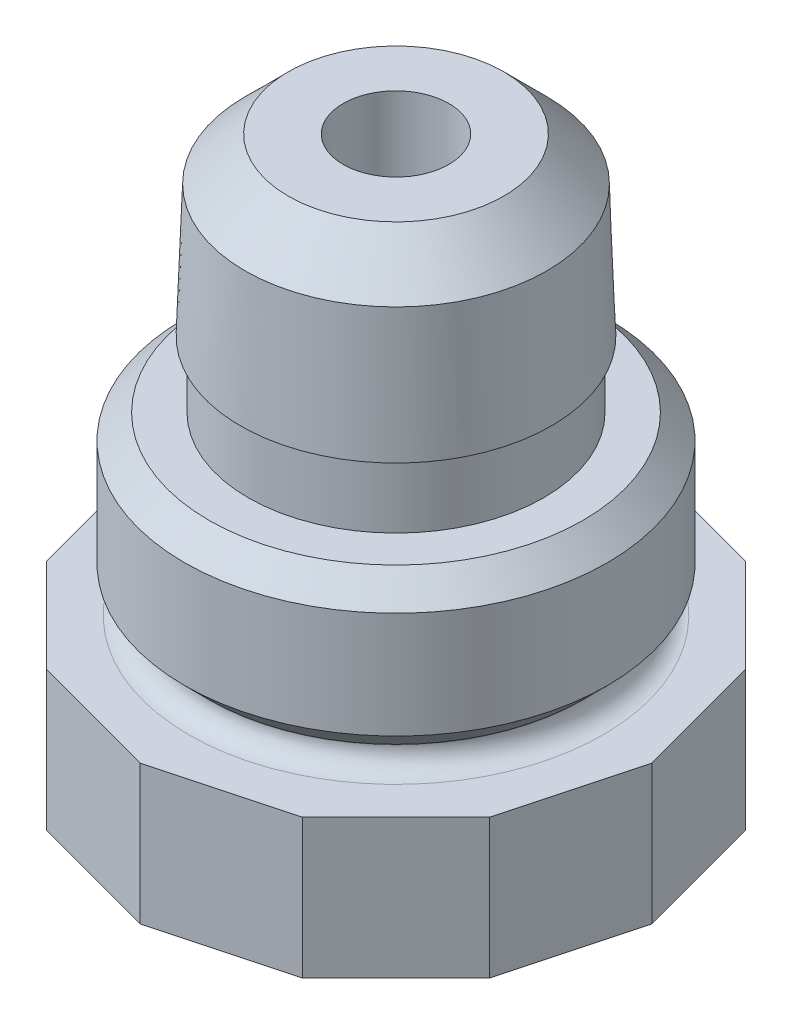
ISO-10303-21;
HEADER;
FILE_DESCRIPTION(('STEP AP214'),'2;1');
FILE_NAME('part.step','',(''),(''),'','','');
FILE_SCHEMA(('AUTOMOTIVE_DESIGN { 1 0 10303 214 1 1 1 1 }'));
ENDSEC;
DATA;
#1=APPLICATION_CONTEXT('core data for automotive mechanical design processes');
#2=APPLICATION_PROTOCOL_DEFINITION('international standard','automotive_design',2000,#1);
#3=PRODUCT_CONTEXT('',#1,'mechanical');
#4=PRODUCT('Part','Part','',(#3));
#5=PRODUCT_RELATED_PRODUCT_CATEGORY('part','',(#4));
#6=PRODUCT_DEFINITION_FORMATION('','',#4);
#7=PRODUCT_DEFINITION_CONTEXT('part definition',#1,'design');
#8=PRODUCT_DEFINITION('design','',#6,#7);
#9=PRODUCT_DEFINITION_SHAPE('','',#8);
#10=(LENGTH_UNIT() NAMED_UNIT(*) SI_UNIT(.MILLI.,.METRE.));
#11=(NAMED_UNIT(*) PLANE_ANGLE_UNIT() SI_UNIT($,.RADIAN.));
#12=(NAMED_UNIT(*) SI_UNIT($,.STERADIAN.) SOLID_ANGLE_UNIT());
#13=UNCERTAINTY_MEASURE_WITH_UNIT(LENGTH_MEASURE(1.E-05),#10,'distance_accuracy_value','');
#14=(GEOMETRIC_REPRESENTATION_CONTEXT(3) GLOBAL_UNCERTAINTY_ASSIGNED_CONTEXT((#13)) GLOBAL_UNIT_ASSIGNED_CONTEXT((#10,
#11,#12)) REPRESENTATION_CONTEXT('',''));
#15=CARTESIAN_POINT('',(0.,0.,0.));
#16=DIRECTION('',(0.,0.,1.));
#17=DIRECTION('',(1.,0.,0.));
#18=AXIS2_PLACEMENT_3D('',#15,#16,#17);
#19=CARTESIAN_POINT('',(-13.2264323420944,-7.54,-22.9088528193797));
#20=DIRECTION('',(0.,1.,0.));
#21=DIRECTION('',(0.,0.,1.));
#22=AXIS2_PLACEMENT_3D('',#19,#20,#21);
#23=PLANE('',#22);
#24=DIRECTION('',(-0.965925826289068,0.,-0.258819045102521));
#25=VECTOR('',#24,1.);
#26=CARTESIAN_POINT('',(9.68242047728531,-7.54,-16.7704442069035));
#27=LINE('',#26,#25);
#28=CARTESIAN_POINT('',(9.68242047728531,-7.54,-16.7704442069035));
#29=VERTEX_POINT('',#28);
#30=CARTESIAN_POINT('',(0.,-7.54,-19.3648409545706));
#31=VERTEX_POINT('',#30);
#32=EDGE_CURVE('E175',#29,#31,#27,.T.);
#33=ORIENTED_EDGE('',*,*,#32,.F.);
#34=DIRECTION('',(-0.707106781186548,0.,-0.707106781186548));
#35=VECTOR('',#34,1.);
#36=CARTESIAN_POINT('',(16.7704442069035,-7.54,-9.68242047728531));
#37=LINE('',#36,#35);
#38=CARTESIAN_POINT('',(16.7704442069035,-7.54,-9.68242047728531));
#39=VERTEX_POINT('',#38);
#40=EDGE_CURVE('E131',#39,#29,#37,.T.);
#41=ORIENTED_EDGE('',*,*,#40,.F.);
#42=DIRECTION('',(-0.25881904510252,0.,-0.965925826289068));
#43=VECTOR('',#42,1.);
#44=CARTESIAN_POINT('',(19.3648409545706,-7.54,0.));
#45=LINE('',#44,#43);
#46=CARTESIAN_POINT('',(19.3648409545706,-7.54,0.));
#47=VERTEX_POINT('',#46);
#48=EDGE_CURVE('E116',#47,#39,#45,.T.);
#49=ORIENTED_EDGE('',*,*,#48,.F.);
#50=DIRECTION('',(0.258819045102522,0.,-0.965925826289068));
#51=VECTOR('',#50,1.);
#52=CARTESIAN_POINT('',(16.7704442069034,-7.54,9.68242047728536));
#53=LINE('',#52,#51);
#54=CARTESIAN_POINT('',(16.7704442069034,-7.54,9.68242047728536));
#55=VERTEX_POINT('',#54);
#56=EDGE_CURVE('E129',#55,#47,#53,.T.);
#57=ORIENTED_EDGE('',*,*,#56,.F.);
#58=DIRECTION('',(0.707106781186547,0.,-0.707106781186547));
#59=VECTOR('',#58,1.);
#60=CARTESIAN_POINT('',(9.68242047728534,-7.54,16.7704442069034));
#61=LINE('',#60,#59);
#62=CARTESIAN_POINT('',(9.68242047728534,-7.54,16.7704442069034));
#63=VERTEX_POINT('',#62);
#64=EDGE_CURVE('E134',#63,#55,#61,.T.);
#65=ORIENTED_EDGE('',*,*,#64,.F.);
#66=DIRECTION('',(0.965925826289068,0.,-0.258819045102521));
#67=VECTOR('',#66,1.);
#68=CARTESIAN_POINT('',(0.,-7.54,19.3648409545706));
#69=LINE('',#68,#67);
#70=CARTESIAN_POINT('',(0.,-7.54,19.3648409545706));
#71=VERTEX_POINT('',#70);
#72=EDGE_CURVE('E136',#71,#63,#69,.T.);
#73=ORIENTED_EDGE('',*,*,#72,.F.);
#74=DIRECTION('',(0.965925826289068,0.,0.258819045102521));
#75=VECTOR('',#74,1.);
#76=CARTESIAN_POINT('',(-9.68242047728527,-7.54,16.7704442069035));
#77=LINE('',#76,#75);
#78=CARTESIAN_POINT('',(-9.68242047728527,-7.54,16.7704442069035));
#79=VERTEX_POINT('',#78);
#80=EDGE_CURVE('E275',#79,#71,#77,.T.);
#81=ORIENTED_EDGE('',*,*,#80,.F.);
#82=DIRECTION('',(0.707106781186548,0.,0.707106781186548));
#83=VECTOR('',#82,1.);
#84=CARTESIAN_POINT('',(-16.7704442069034,-7.54,9.68242047728531));
#85=LINE('',#84,#83);
#86=CARTESIAN_POINT('',(-16.7704442069034,-7.54,9.68242047728531));
#87=VERTEX_POINT('',#86);
#88=EDGE_CURVE('E276',#87,#79,#85,.T.);
#89=ORIENTED_EDGE('',*,*,#88,.F.);
#90=DIRECTION('',(0.258819045102521,0.,0.965925826289068));
#91=VECTOR('',#90,1.);
#92=CARTESIAN_POINT('',(-19.3648409545706,-7.54,0.));
#93=LINE('',#92,#91);
#94=CARTESIAN_POINT('',(-19.3648409545706,-7.54,0.));
#95=VERTEX_POINT('',#94);
#96=EDGE_CURVE('E281',#95,#87,#93,.T.);
#97=ORIENTED_EDGE('',*,*,#96,.F.);
#98=DIRECTION('',(-0.258819045102521,0.,0.965925826289068));
#99=VECTOR('',#98,1.);
#100=CARTESIAN_POINT('',(-16.7704442069034,-7.54,-9.68242047728533));
#101=LINE('',#100,#99);
#102=CARTESIAN_POINT('',(-16.7704442069034,-7.54,-9.68242047728533));
#103=VERTEX_POINT('',#102);
#104=EDGE_CURVE('E284',#103,#95,#101,.T.);
#105=ORIENTED_EDGE('',*,*,#104,.F.);
#106=DIRECTION('',(-0.707106781186548,0.,0.707106781186547));
#107=VECTOR('',#106,1.);
#108=CARTESIAN_POINT('',(-9.68242047728532,-7.54,-16.7704442069034));
#109=LINE('',#108,#107);
#110=CARTESIAN_POINT('',(-9.68242047728532,-7.54,-16.7704442069034));
#111=VERTEX_POINT('',#110);
#112=EDGE_CURVE('E287',#111,#103,#109,.T.);
#113=ORIENTED_EDGE('',*,*,#112,.F.);
#114=DIRECTION('',(-0.965925826289068,0.,0.25881904510252));
#115=VECTOR('',#114,1.);
#116=CARTESIAN_POINT('',(0.,-7.54,-19.3648409545706));
#117=LINE('',#116,#115);
#118=EDGE_CURVE('E290',#31,#111,#117,.T.);
#119=ORIENTED_EDGE('',*,*,#118,.F.);
#120=EDGE_LOOP('',(#33,#41,#49,#57,#65,#73,#81,#89,#97,#105,#113,#119));
#121=FACE_BOUND('',#120,.T.);
#122=CARTESIAN_POINT('',(0.,-7.54,0.));
#123=DIRECTION('',(0.,-1.,0.));
#124=DIRECTION('',(0.,0.,-1.));
#125=AXIS2_PLACEMENT_3D('',#122,#123,#124);
#126=CIRCLE('',#125,15.1);
#127=CARTESIAN_POINT('',(0.,-7.54,-15.1));
#128=VERTEX_POINT('',#127);
#129=EDGE_CURVE('E322',#128,#128,#126,.T.);
#130=ORIENTED_EDGE('',*,*,#129,.F.);
#131=EDGE_LOOP('',(#130));
#132=FACE_BOUND('',#131,.T.);
#133=ADVANCED_FACE('F17',(#121,#132),#23,.F.);
#134=CARTESIAN_POINT('',(-13.2264323420944,3.,-22.9088528193797));
#135=DIRECTION('',(0.,1.,0.));
#136=DIRECTION('',(0.,0.,1.));
#137=AXIS2_PLACEMENT_3D('',#134,#135,#136);
#138=PLANE('',#137);
#139=CARTESIAN_POINT('',(0.,3.,0.));
#140=DIRECTION('',(0.,1.,0.));
#141=DIRECTION('',(0.,0.,1.));
#142=AXIS2_PLACEMENT_3D('',#139,#140,#141);
#143=CIRCLE('',#142,15.67);
#144=CARTESIAN_POINT('',(0.,3.,15.67));
#145=VERTEX_POINT('',#144);
#146=EDGE_CURVE('E26',#145,#145,#143,.F.);
#147=ORIENTED_EDGE('',*,*,#146,.T.);
#148=EDGE_LOOP('',(#147));
#149=FACE_BOUND('',#148,.T.);
#150=DIRECTION('',(-0.965925826289068,0.,-0.258819045102521));
#151=VECTOR('',#150,1.);
#152=CARTESIAN_POINT('',(9.68242047728531,3.,-16.7704442069035));
#153=LINE('',#152,#151);
#154=CARTESIAN_POINT('',(9.68242047728531,3.,-16.7704442069035));
#155=VERTEX_POINT('',#154);
#156=CARTESIAN_POINT('',(0.,3.,-19.3648409545706));
#157=VERTEX_POINT('',#156);
#158=EDGE_CURVE('E141',#155,#157,#153,.T.);
#159=ORIENTED_EDGE('',*,*,#158,.T.);
#160=DIRECTION('',(-0.965925826289068,0.,0.25881904510252));
#161=VECTOR('',#160,1.);
#162=CARTESIAN_POINT('',(0.,3.,-19.3648409545706));
#163=LINE('',#162,#161);
#164=CARTESIAN_POINT('',(-9.68242047728532,3.,-16.7704442069034));
#165=VERTEX_POINT('',#164);
#166=EDGE_CURVE('E144',#157,#165,#163,.T.);
#167=ORIENTED_EDGE('',*,*,#166,.T.);
#168=DIRECTION('',(-0.707106781186548,0.,0.707106781186547));
#169=VECTOR('',#168,1.);
#170=CARTESIAN_POINT('',(-9.68242047728532,3.,-16.7704442069034));
#171=LINE('',#170,#169);
#172=CARTESIAN_POINT('',(-16.7704442069034,3.,-9.68242047728533));
#173=VERTEX_POINT('',#172);
#174=EDGE_CURVE('E148',#165,#173,#171,.T.);
#175=ORIENTED_EDGE('',*,*,#174,.T.);
#176=DIRECTION('',(-0.258819045102521,0.,0.965925826289068));
#177=VECTOR('',#176,1.);
#178=CARTESIAN_POINT('',(-16.7704442069034,3.,-9.68242047728533));
#179=LINE('',#178,#177);
#180=CARTESIAN_POINT('',(-19.3648409545706,3.,0.));
#181=VERTEX_POINT('',#180);
#182=EDGE_CURVE('E151',#173,#181,#179,.T.);
#183=ORIENTED_EDGE('',*,*,#182,.T.);
#184=DIRECTION('',(0.258819045102521,0.,0.965925826289068));
#185=VECTOR('',#184,1.);
#186=CARTESIAN_POINT('',(-19.3648409545706,3.,0.));
#187=LINE('',#186,#185);
#188=CARTESIAN_POINT('',(-16.7704442069034,3.,9.68242047728531));
#189=VERTEX_POINT('',#188);
#190=EDGE_CURVE('E154',#181,#189,#187,.T.);
#191=ORIENTED_EDGE('',*,*,#190,.T.);
#192=DIRECTION('',(0.707106781186548,0.,0.707106781186548));
#193=VECTOR('',#192,1.);
#194=CARTESIAN_POINT('',(-16.7704442069034,3.,9.68242047728531));
#195=LINE('',#194,#193);
#196=CARTESIAN_POINT('',(-9.68242047728527,3.,16.7704442069035));
#197=VERTEX_POINT('',#196);
#198=EDGE_CURVE('E157',#189,#197,#195,.T.);
#199=ORIENTED_EDGE('',*,*,#198,.T.);
#200=DIRECTION('',(0.965925826289068,0.,0.258819045102521));
#201=VECTOR('',#200,1.);
#202=CARTESIAN_POINT('',(-9.68242047728527,3.,16.7704442069035));
#203=LINE('',#202,#201);
#204=CARTESIAN_POINT('',(0.,3.,19.3648409545706));
#205=VERTEX_POINT('',#204);
#206=EDGE_CURVE('E160',#197,#205,#203,.T.);
#207=ORIENTED_EDGE('',*,*,#206,.T.);
#208=DIRECTION('',(0.965925826289068,0.,-0.258819045102521));
#209=VECTOR('',#208,1.);
#210=CARTESIAN_POINT('',(0.,3.,19.3648409545706));
#211=LINE('',#210,#209);
#212=CARTESIAN_POINT('',(9.68242047728534,3.,16.7704442069034));
#213=VERTEX_POINT('',#212);
#214=EDGE_CURVE('E163',#205,#213,#211,.T.);
#215=ORIENTED_EDGE('',*,*,#214,.T.);
#216=DIRECTION('',(0.707106781186547,0.,-0.707106781186547));
#217=VECTOR('',#216,1.);
#218=CARTESIAN_POINT('',(9.68242047728534,3.,16.7704442069034));
#219=LINE('',#218,#217);
#220=CARTESIAN_POINT('',(16.7704442069034,3.,9.68242047728536));
#221=VERTEX_POINT('',#220);
#222=EDGE_CURVE('E166',#213,#221,#219,.T.);
#223=ORIENTED_EDGE('',*,*,#222,.T.);
#224=DIRECTION('',(0.258819045102522,0.,-0.965925826289068));
#225=VECTOR('',#224,1.);
#226=CARTESIAN_POINT('',(16.7704442069034,3.,9.68242047728536));
#227=LINE('',#226,#225);
#228=CARTESIAN_POINT('',(19.3648409545706,3.,0.));
#229=VERTEX_POINT('',#228);
#230=EDGE_CURVE('E169',#221,#229,#227,.T.);
#231=ORIENTED_EDGE('',*,*,#230,.T.);
#232=DIRECTION('',(-0.25881904510252,0.,-0.965925826289068));
#233=VECTOR('',#232,1.);
#234=CARTESIAN_POINT('',(19.3648409545706,3.,0.));
#235=LINE('',#234,#233);
#236=CARTESIAN_POINT('',(16.7704442069035,3.,-9.68242047728531));
#237=VERTEX_POINT('',#236);
#238=EDGE_CURVE('E118',#229,#237,#235,.T.);
#239=ORIENTED_EDGE('',*,*,#238,.T.);
#240=DIRECTION('',(-0.707106781186548,0.,-0.707106781186548));
#241=VECTOR('',#240,1.);
#242=CARTESIAN_POINT('',(16.7704442069035,3.,-9.68242047728531));
#243=LINE('',#242,#241);
#244=EDGE_CURVE('E172',#237,#155,#243,.T.);
#245=ORIENTED_EDGE('',*,*,#244,.T.);
#246=EDGE_LOOP('',(#159,#167,#175,#183,#191,#199,#207,#215,#223,#231,#239,#245));
#247=FACE_BOUND('',#246,.T.);
#248=ADVANCED_FACE('F196',(#149,#247),#138,.T.);
#249=CARTESIAN_POINT('',(9.68242047728531,-7.54,-16.7704442069035));
#250=DIRECTION('',(0.258819045102521,0.,-0.965925826289068));
#251=DIRECTION('',(-0.965925826289068,0.,-0.258819045102521));
#252=AXIS2_PLACEMENT_3D('',#249,#250,#251);
#253=PLANE('',#252);
#254=ORIENTED_EDGE('',*,*,#158,.F.);
#255=DIRECTION('',(0.,1.,0.));
#256=VECTOR('',#255,1.);
#257=CARTESIAN_POINT('',(9.68242047728531,-7.54,-16.7704442069035));
#258=LINE('',#257,#256);
#259=EDGE_CURVE('E34',#29,#155,#258,.T.);
#260=ORIENTED_EDGE('',*,*,#259,.F.);
#261=ORIENTED_EDGE('',*,*,#32,.T.);
#262=DIRECTION('',(0.,1.,0.));
#263=VECTOR('',#262,1.);
#264=CARTESIAN_POINT('',(0.,-7.54,-19.3648409545706));
#265=LINE('',#264,#263);
#266=EDGE_CURVE('E87',#31,#157,#265,.T.);
#267=ORIENTED_EDGE('',*,*,#266,.T.);
#268=EDGE_LOOP('',(#254,#260,#261,#267));
#269=FACE_BOUND('',#268,.T.);
#270=ADVANCED_FACE('F222',(#269),#253,.T.);
#271=CARTESIAN_POINT('',(16.7704442069035,-7.54,-9.68242047728531));
#272=DIRECTION('',(0.707106781186547,0.,-0.707106781186547));
#273=DIRECTION('',(-0.707106781186548,0.,-0.707106781186548));
#274=AXIS2_PLACEMENT_3D('',#271,#272,#273);
#275=PLANE('',#274);
#276=ORIENTED_EDGE('',*,*,#244,.F.);
#277=DIRECTION('',(0.,1.,0.));
#278=VECTOR('',#277,1.);
#279=CARTESIAN_POINT('',(16.7704442069035,-7.54,-9.68242047728531));
#280=LINE('',#279,#278);
#281=EDGE_CURVE('E75',#39,#237,#280,.T.);
#282=ORIENTED_EDGE('',*,*,#281,.F.);
#283=ORIENTED_EDGE('',*,*,#40,.T.);
#284=ORIENTED_EDGE('',*,*,#259,.T.);
#285=EDGE_LOOP('',(#276,#282,#283,#284));
#286=FACE_BOUND('',#285,.T.);
#287=ADVANCED_FACE('F228',(#286),#275,.T.);
#288=CARTESIAN_POINT('',(19.3648409545706,-7.54,0.));
#289=DIRECTION('',(0.965925826289068,0.,-0.25881904510252));
#290=DIRECTION('',(-0.25881904510252,0.,-0.965925826289069));
#291=AXIS2_PLACEMENT_3D('',#288,#289,#290);
#292=PLANE('',#291);
#293=ORIENTED_EDGE('',*,*,#238,.F.);
#294=DIRECTION('',(0.,1.,0.));
#295=VECTOR('',#294,1.);
#296=CARTESIAN_POINT('',(19.3648409545706,-7.54,0.));
#297=LINE('',#296,#295);
#298=EDGE_CURVE('E113',#47,#229,#297,.T.);
#299=ORIENTED_EDGE('',*,*,#298,.F.);
#300=ORIENTED_EDGE('',*,*,#48,.T.);
#301=ORIENTED_EDGE('',*,*,#281,.T.);
#302=EDGE_LOOP('',(#293,#299,#300,#301));
#303=FACE_BOUND('',#302,.T.);
#304=ADVANCED_FACE('F115',(#303),#292,.T.);
#305=CARTESIAN_POINT('',(16.7704442069034,-7.54,9.68242047728536));
#306=DIRECTION('',(0.965925826289068,0.,0.258819045102522));
#307=DIRECTION('',(0.258819045102522,0.,-0.965925826289068));
#308=AXIS2_PLACEMENT_3D('',#305,#306,#307);
#309=PLANE('',#308);
#310=ORIENTED_EDGE('',*,*,#230,.F.);
#311=DIRECTION('',(0.,1.,0.));
#312=VECTOR('',#311,1.);
#313=CARTESIAN_POINT('',(16.7704442069034,-7.54,9.68242047728536));
#314=LINE('',#313,#312);
#315=EDGE_CURVE('E123',#55,#221,#314,.T.);
#316=ORIENTED_EDGE('',*,*,#315,.F.);
#317=ORIENTED_EDGE('',*,*,#56,.T.);
#318=ORIENTED_EDGE('',*,*,#298,.T.);
#319=EDGE_LOOP('',(#310,#316,#317,#318));
#320=FACE_BOUND('',#319,.T.);
#321=ADVANCED_FACE('F133',(#320),#309,.T.);
#322=CARTESIAN_POINT('',(9.68242047728534,-7.54,16.7704442069034));
#323=DIRECTION('',(0.707106781186547,0.,0.707106781186547));
#324=DIRECTION('',(0.707106781186548,0.,-0.707106781186548));
#325=AXIS2_PLACEMENT_3D('',#322,#323,#324);
#326=PLANE('',#325);
#327=ORIENTED_EDGE('',*,*,#222,.F.);
#328=DIRECTION('',(0.,1.,0.));
#329=VECTOR('',#328,1.);
#330=CARTESIAN_POINT('',(9.68242047728534,-7.54,16.7704442069034));
#331=LINE('',#330,#329);
#332=EDGE_CURVE('E179',#63,#213,#331,.T.);
#333=ORIENTED_EDGE('',*,*,#332,.F.);
#334=ORIENTED_EDGE('',*,*,#64,.T.);
#335=ORIENTED_EDGE('',*,*,#315,.T.);
#336=EDGE_LOOP('',(#327,#333,#334,#335));
#337=FACE_BOUND('',#336,.T.);
#338=ADVANCED_FACE('F235',(#337),#326,.T.);
#339=CARTESIAN_POINT('',(0.,-7.54,19.3648409545706));
#340=DIRECTION('',(0.258819045102521,0.,0.965925826289068));
#341=DIRECTION('',(0.965925826289068,0.,-0.258819045102521));
#342=AXIS2_PLACEMENT_3D('',#339,#340,#341);
#343=PLANE('',#342);
#344=ORIENTED_EDGE('',*,*,#214,.F.);
#345=DIRECTION('',(0.,1.,0.));
#346=VECTOR('',#345,1.);
#347=CARTESIAN_POINT('',(0.,-7.54,19.3648409545706));
#348=LINE('',#347,#346);
#349=EDGE_CURVE('E181',#71,#205,#348,.T.);
#350=ORIENTED_EDGE('',*,*,#349,.F.);
#351=ORIENTED_EDGE('',*,*,#72,.T.);
#352=ORIENTED_EDGE('',*,*,#332,.T.);
#353=EDGE_LOOP('',(#344,#350,#351,#352));
#354=FACE_BOUND('',#353,.T.);
#355=ADVANCED_FACE('F238',(#354),#343,.T.);
#356=CARTESIAN_POINT('',(-9.68242047728527,-7.54,16.7704442069035));
#357=DIRECTION('',(-0.258819045102521,0.,0.965925826289068));
#358=DIRECTION('',(0.965925826289068,0.,0.258819045102521));
#359=AXIS2_PLACEMENT_3D('',#356,#357,#358);
#360=PLANE('',#359);
#361=ORIENTED_EDGE('',*,*,#206,.F.);
#362=DIRECTION('',(0.,1.,0.));
#363=VECTOR('',#362,1.);
#364=CARTESIAN_POINT('',(-9.68242047728527,-7.54,16.7704442069035));
#365=LINE('',#364,#363);
#366=EDGE_CURVE('E183',#79,#197,#365,.T.);
#367=ORIENTED_EDGE('',*,*,#366,.F.);
#368=ORIENTED_EDGE('',*,*,#80,.T.);
#369=ORIENTED_EDGE('',*,*,#349,.T.);
#370=EDGE_LOOP('',(#361,#367,#368,#369));
#371=FACE_BOUND('',#370,.T.);
#372=ADVANCED_FACE('F242',(#371),#360,.T.);
#373=CARTESIAN_POINT('',(-16.7704442069034,-7.54,9.68242047728531));
#374=DIRECTION('',(-0.707106781186547,0.,0.707106781186547));
#375=DIRECTION('',(0.707106781186548,0.,0.707106781186548));
#376=AXIS2_PLACEMENT_3D('',#373,#374,#375);
#377=PLANE('',#376);
#378=ORIENTED_EDGE('',*,*,#198,.F.);
#379=DIRECTION('',(0.,1.,0.));
#380=VECTOR('',#379,1.);
#381=CARTESIAN_POINT('',(-16.7704442069034,-7.54,9.68242047728531));
#382=LINE('',#381,#380);
#383=EDGE_CURVE('E185',#87,#189,#382,.T.);
#384=ORIENTED_EDGE('',*,*,#383,.F.);
#385=ORIENTED_EDGE('',*,*,#88,.T.);
#386=ORIENTED_EDGE('',*,*,#366,.T.);
#387=EDGE_LOOP('',(#378,#384,#385,#386));
#388=FACE_BOUND('',#387,.T.);
#389=ADVANCED_FACE('F246',(#388),#377,.T.);
#390=CARTESIAN_POINT('',(-19.3648409545706,-7.54,0.));
#391=DIRECTION('',(-0.965925826289068,0.,0.258819045102521));
#392=DIRECTION('',(0.258819045102521,0.,0.965925826289068));
#393=AXIS2_PLACEMENT_3D('',#390,#391,#392);
#394=PLANE('',#393);
#395=ORIENTED_EDGE('',*,*,#190,.F.);
#396=DIRECTION('',(0.,1.,0.));
#397=VECTOR('',#396,1.);
#398=CARTESIAN_POINT('',(-19.3648409545706,-7.54,0.));
#399=LINE('',#398,#397);
#400=EDGE_CURVE('E187',#95,#181,#399,.T.);
#401=ORIENTED_EDGE('',*,*,#400,.F.);
#402=ORIENTED_EDGE('',*,*,#96,.T.);
#403=ORIENTED_EDGE('',*,*,#383,.T.);
#404=EDGE_LOOP('',(#395,#401,#402,#403));
#405=FACE_BOUND('',#404,.T.);
#406=ADVANCED_FACE('F250',(#405),#394,.T.);
#407=CARTESIAN_POINT('',(-16.7704442069034,-7.54,-9.68242047728533));
#408=DIRECTION('',(-0.965925826289068,0.,-0.258819045102521));
#409=DIRECTION('',(-0.258819045102521,0.,0.965925826289068));
#410=AXIS2_PLACEMENT_3D('',#407,#408,#409);
#411=PLANE('',#410);
#412=ORIENTED_EDGE('',*,*,#182,.F.);
#413=DIRECTION('',(0.,1.,0.));
#414=VECTOR('',#413,1.);
#415=CARTESIAN_POINT('',(-16.7704442069034,-7.54,-9.68242047728533));
#416=LINE('',#415,#414);
#417=EDGE_CURVE('E189',#103,#173,#416,.T.);
#418=ORIENTED_EDGE('',*,*,#417,.F.);
#419=ORIENTED_EDGE('',*,*,#104,.T.);
#420=ORIENTED_EDGE('',*,*,#400,.T.);
#421=EDGE_LOOP('',(#412,#418,#419,#420));
#422=FACE_BOUND('',#421,.T.);
#423=ADVANCED_FACE('F254',(#422),#411,.T.);
#424=CARTESIAN_POINT('',(-9.68242047728532,-7.54,-16.7704442069034));
#425=DIRECTION('',(-0.707106781186547,0.,-0.707106781186548));
#426=DIRECTION('',(-0.707106781186548,0.,0.707106781186547));
#427=AXIS2_PLACEMENT_3D('',#424,#425,#426);
#428=PLANE('',#427);
#429=ORIENTED_EDGE('',*,*,#174,.F.);
#430=DIRECTION('',(0.,1.,0.));
#431=VECTOR('',#430,1.);
#432=CARTESIAN_POINT('',(-9.68242047728532,-7.54,-16.7704442069034));
#433=LINE('',#432,#431);
#434=EDGE_CURVE('E191',#111,#165,#433,.T.);
#435=ORIENTED_EDGE('',*,*,#434,.F.);
#436=ORIENTED_EDGE('',*,*,#112,.T.);
#437=ORIENTED_EDGE('',*,*,#417,.T.);
#438=EDGE_LOOP('',(#429,#435,#436,#437));
#439=FACE_BOUND('',#438,.T.);
#440=ADVANCED_FACE('F258',(#439),#428,.T.);
#441=CARTESIAN_POINT('',(0.,-7.54,-19.3648409545706));
#442=DIRECTION('',(-0.25881904510252,0.,-0.965925826289068));
#443=DIRECTION('',(-0.965925826289068,0.,0.25881904510252));
#444=AXIS2_PLACEMENT_3D('',#441,#442,#443);
#445=PLANE('',#444);
#446=ORIENTED_EDGE('',*,*,#166,.F.);
#447=ORIENTED_EDGE('',*,*,#266,.F.);
#448=ORIENTED_EDGE('',*,*,#118,.T.);
#449=ORIENTED_EDGE('',*,*,#434,.T.);
#450=EDGE_LOOP('',(#446,#447,#448,#449));
#451=FACE_BOUND('',#450,.T.);
#452=ADVANCED_FACE('F262',(#451),#445,.T.);
#453=CARTESIAN_POINT('',(0.,0.,0.));
#454=DIRECTION('',(0.,-1.,0.));
#455=DIRECTION('',(0.,0.,-1.));
#456=AXIS2_PLACEMENT_3D('',#453,#454,#455);
#457=CYLINDRICAL_SURFACE('',#456,14.15);
#458=CARTESIAN_POINT('',(0.,4.52,0.));
#459=DIRECTION('',(0.,1.,0.));
#460=DIRECTION('',(0.,0.,1.));
#461=AXIS2_PLACEMENT_3D('',#458,#459,#460);
#462=CIRCLE('',#461,14.15);
#463=CARTESIAN_POINT('',(0.,4.52,14.15));
#464=VERTEX_POINT('',#463);
#465=EDGE_CURVE('E11',#464,#464,#462,.T.);
#466=ORIENTED_EDGE('',*,*,#465,.T.);
#467=EDGE_LOOP('',(#466));
#468=FACE_BOUND('',#467,.T.);
#469=CARTESIAN_POINT('',(0.,4.55,0.));
#470=DIRECTION('',(0.,-1.,0.));
#471=DIRECTION('',(0.,0.,-1.));
#472=AXIS2_PLACEMENT_3D('',#469,#470,#471);
#473=CIRCLE('',#472,14.15);
#474=CARTESIAN_POINT('',(0.,4.55,-14.15));
#475=VERTEX_POINT('',#474);
#476=EDGE_CURVE('E145',#475,#475,#473,.T.);
#477=ORIENTED_EDGE('',*,*,#476,.T.);
#478=EDGE_LOOP('',(#477));
#479=FACE_BOUND('',#478,.T.);
#480=ADVANCED_FACE('F225',(#468,#479),#457,.T.);
#481=CARTESIAN_POINT('',(0.,6.4,0.));
#482=DIRECTION('',(0.,1.,0.));
#483=DIRECTION('',(0.,0.,1.));
#484=AXIS2_PLACEMENT_3D('',#481,#482,#483);
#485=CONICAL_SURFACE('',#484,16.,0.785398163397447);
#486=ORIENTED_EDGE('',*,*,#476,.F.);
#487=EDGE_LOOP('',(#486));
#488=FACE_BOUND('',#487,.T.);
#489=CARTESIAN_POINT('',(0.,6.4,0.));
#490=DIRECTION('',(0.,-1.,0.));
#491=DIRECTION('',(0.,0.,-1.));
#492=AXIS2_PLACEMENT_3D('',#489,#490,#491);
#493=CIRCLE('',#492,16.);
#494=CARTESIAN_POINT('',(0.,6.4,-16.));
#495=VERTEX_POINT('',#494);
#496=EDGE_CURVE('E295',#495,#495,#493,.T.);
#497=ORIENTED_EDGE('',*,*,#496,.T.);
#498=EDGE_LOOP('',(#497));
#499=FACE_BOUND('',#498,.T.);
#500=ADVANCED_FACE('F372',(#488,#499),#485,.T.);
#501=CARTESIAN_POINT('',(0.,0.,0.));
#502=DIRECTION('',(0.,-1.,0.));
#503=DIRECTION('',(0.,0.,-1.));
#504=AXIS2_PLACEMENT_3D('',#501,#502,#503);
#505=CYLINDRICAL_SURFACE('',#504,16.);
#506=ORIENTED_EDGE('',*,*,#496,.F.);
#507=EDGE_LOOP('',(#506));
#508=FACE_BOUND('',#507,.T.);
#509=CARTESIAN_POINT('',(0.,14.45,0.));
#510=DIRECTION('',(0.,-1.,0.));
#511=DIRECTION('',(0.,0.,-1.));
#512=AXIS2_PLACEMENT_3D('',#509,#510,#511);
#513=CIRCLE('',#512,16.);
#514=CARTESIAN_POINT('',(0.,14.45,-16.));
#515=VERTEX_POINT('',#514);
#516=EDGE_CURVE('E298',#515,#515,#513,.T.);
#517=ORIENTED_EDGE('',*,*,#516,.T.);
#518=EDGE_LOOP('',(#517));
#519=FACE_BOUND('',#518,.T.);
#520=ADVANCED_FACE('F369',(#508,#519),#505,.T.);
#521=CARTESIAN_POINT('',(0.,16.3,0.));
#522=DIRECTION('',(0.,-1.,0.));
#523=DIRECTION('',(0.,0.,-1.));
#524=AXIS2_PLACEMENT_3D('',#521,#522,#523);
#525=CONICAL_SURFACE('',#524,14.15,0.78539816339745);
#526=ORIENTED_EDGE('',*,*,#516,.F.);
#527=EDGE_LOOP('',(#526));
#528=FACE_BOUND('',#527,.T.);
#529=CARTESIAN_POINT('',(0.,16.3,0.));
#530=DIRECTION('',(0.,-1.,0.));
#531=DIRECTION('',(0.,0.,-1.));
#532=AXIS2_PLACEMENT_3D('',#529,#530,#531);
#533=CIRCLE('',#532,14.15);
#534=CARTESIAN_POINT('',(0.,16.3,-14.15));
#535=VERTEX_POINT('',#534);
#536=EDGE_CURVE('E301',#535,#535,#533,.T.);
#537=ORIENTED_EDGE('',*,*,#536,.T.);
#538=EDGE_LOOP('',(#537));
#539=FACE_BOUND('',#538,.T.);
#540=ADVANCED_FACE('F365',(#528,#539),#525,.T.);
#541=CARTESIAN_POINT('',(-14.15,16.3,0.));
#542=DIRECTION('',(0.,-1.,0.));
#543=DIRECTION('',(0.,0.,-1.));
#544=AXIS2_PLACEMENT_3D('',#541,#542,#543);
#545=PLANE('',#544);
#546=ORIENTED_EDGE('',*,*,#536,.F.);
#547=EDGE_LOOP('',(#546));
#548=FACE_BOUND('',#547,.T.);
#549=CARTESIAN_POINT('',(0.,16.3,0.));
#550=DIRECTION('',(0.,-1.,0.));
#551=DIRECTION('',(0.,0.,-1.));
#552=AXIS2_PLACEMENT_3D('',#549,#550,#551);
#553=CIRCLE('',#552,11.185);
#554=CARTESIAN_POINT('',(0.,16.3,-11.185));
#555=VERTEX_POINT('',#554);
#556=EDGE_CURVE('E304',#555,#555,#553,.T.);
#557=ORIENTED_EDGE('',*,*,#556,.T.);
#558=EDGE_LOOP('',(#557));
#559=FACE_BOUND('',#558,.T.);
#560=ADVANCED_FACE('F361',(#548,#559),#545,.F.);
#561=CARTESIAN_POINT('',(0.,0.,0.));
#562=DIRECTION('',(0.,-1.,0.));
#563=DIRECTION('',(0.,0.,-1.));
#564=AXIS2_PLACEMENT_3D('',#561,#562,#563);
#565=CYLINDRICAL_SURFACE('',#564,11.185);
#566=ORIENTED_EDGE('',*,*,#556,.F.);
#567=EDGE_LOOP('',(#566));
#568=FACE_BOUND('',#567,.T.);
#569=CARTESIAN_POINT('',(0.,21.3,0.));
#570=DIRECTION('',(0.,-1.,0.));
#571=DIRECTION('',(0.,0.,-1.));
#572=AXIS2_PLACEMENT_3D('',#569,#570,#571);
#573=CIRCLE('',#572,11.185);
#574=CARTESIAN_POINT('',(0.,21.3,-11.185));
#575=VERTEX_POINT('',#574);
#576=EDGE_CURVE('E307',#575,#575,#573,.T.);
#577=ORIENTED_EDGE('',*,*,#576,.T.);
#578=EDGE_LOOP('',(#577));
#579=FACE_BOUND('',#578,.T.);
#580=ADVANCED_FACE('F357',(#568,#579),#565,.T.);
#581=CARTESIAN_POINT('',(-11.185,21.3,0.));
#582=DIRECTION('',(0.,1.,0.));
#583=DIRECTION('',(0.,0.,1.));
#584=AXIS2_PLACEMENT_3D('',#581,#582,#583);
#585=PLANE('',#584);
#586=ORIENTED_EDGE('',*,*,#576,.F.);
#587=EDGE_LOOP('',(#586));
#588=FACE_BOUND('',#587,.T.);
#589=CARTESIAN_POINT('',(0.,21.3,0.));
#590=DIRECTION('',(0.,-1.,0.));
#591=DIRECTION('',(0.,0.,-1.));
#592=AXIS2_PLACEMENT_3D('',#589,#590,#591);
#593=CIRCLE('',#592,11.7686838833751);
#594=CARTESIAN_POINT('',(0.,21.3,-11.7686838833751));
#595=VERTEX_POINT('',#594);
#596=EDGE_CURVE('E310',#595,#595,#593,.T.);
#597=ORIENTED_EDGE('',*,*,#596,.T.);
#598=EDGE_LOOP('',(#597));
#599=FACE_BOUND('',#598,.T.);
#600=ADVANCED_FACE('F350',(#588,#599),#585,.F.);
#601=CARTESIAN_POINT('',(0.,31.285,0.));
#602=DIRECTION('',(0.,-1.,0.));
#603=DIRECTION('',(0.,0.,-1.));
#604=AXIS2_PLACEMENT_3D('',#601,#602,#603);
#605=CONICAL_SURFACE('',#604,11.42,0.0349065850398867);
#606=ORIENTED_EDGE('',*,*,#596,.F.);
#607=EDGE_LOOP('',(#606));
#608=FACE_BOUND('',#607,.T.);
#609=CARTESIAN_POINT('',(0.,31.285,0.));
#610=DIRECTION('',(0.,-1.,0.));
#611=DIRECTION('',(0.,0.,-1.));
#612=AXIS2_PLACEMENT_3D('',#609,#610,#611);
#613=CIRCLE('',#612,11.42);
#614=CARTESIAN_POINT('',(0.,31.285,-11.42));
#615=VERTEX_POINT('',#614);
#616=EDGE_CURVE('E313',#615,#615,#613,.T.);
#617=ORIENTED_EDGE('',*,*,#616,.T.);
#618=EDGE_LOOP('',(#617));
#619=FACE_BOUND('',#618,.T.);
#620=ADVANCED_FACE('F343',(#608,#619),#605,.T.);
#621=CARTESIAN_POINT('',(0.,34.55,0.));
#622=DIRECTION('',(0.,-1.,0.));
#623=DIRECTION('',(0.,0.,-1.));
#624=AXIS2_PLACEMENT_3D('',#621,#622,#623);
#625=CONICAL_SURFACE('',#624,8.155,0.78539816339745);
#626=ORIENTED_EDGE('',*,*,#616,.F.);
#627=EDGE_LOOP('',(#626));
#628=FACE_BOUND('',#627,.T.);
#629=CARTESIAN_POINT('',(0.,34.55,0.));
#630=DIRECTION('',(0.,-1.,0.));
#631=DIRECTION('',(0.,0.,-1.));
#632=AXIS2_PLACEMENT_3D('',#629,#630,#631);
#633=CIRCLE('',#632,8.155);
#634=CARTESIAN_POINT('',(0.,34.55,-8.155));
#635=VERTEX_POINT('',#634);
#636=EDGE_CURVE('E316',#635,#635,#633,.T.);
#637=ORIENTED_EDGE('',*,*,#636,.T.);
#638=EDGE_LOOP('',(#637));
#639=FACE_BOUND('',#638,.T.);
#640=ADVANCED_FACE('F212',(#628,#639),#625,.T.);
#641=CARTESIAN_POINT('',(-8.155,34.55,0.));
#642=DIRECTION('',(0.,-1.,0.));
#643=DIRECTION('',(0.,0.,-1.));
#644=AXIS2_PLACEMENT_3D('',#641,#642,#643);
#645=PLANE('',#644);
#646=CARTESIAN_POINT('',(0.,34.55,0.));
#647=DIRECTION('',(0.,1.,0.));
#648=DIRECTION('',(0.,0.,1.));
#649=AXIS2_PLACEMENT_3D('',#646,#647,#648);
#650=CIRCLE('',#649,4.);
#651=CARTESIAN_POINT('',(0.,34.55,4.));
#652=VERTEX_POINT('',#651);
#653=EDGE_CURVE('E326',#652,#652,#650,.T.);
#654=ORIENTED_EDGE('',*,*,#653,.F.);
#655=EDGE_LOOP('',(#654));
#656=FACE_BOUND('',#655,.T.);
#657=ORIENTED_EDGE('',*,*,#636,.F.);
#658=EDGE_LOOP('',(#657));
#659=FACE_BOUND('',#658,.T.);
#660=ADVANCED_FACE('F201',(#656,#659),#645,.F.);
#661=CARTESIAN_POINT('',(0.,4.52,0.));
#662=DIRECTION('',(0.,1.,0.));
#663=DIRECTION('',(0.,0.,1.));
#664=AXIS2_PLACEMENT_3D('',#661,#662,#663);
#665=TOROIDAL_SURFACE('',#664,15.67,1.52);
#666=ORIENTED_EDGE('',*,*,#465,.F.);
#667=EDGE_LOOP('',(#666));
#668=FACE_BOUND('',#667,.T.);
#669=ORIENTED_EDGE('',*,*,#146,.F.);
#670=EDGE_LOOP('',(#669));
#671=FACE_BOUND('',#670,.T.);
#672=ADVANCED_FACE('F19',(#668,#671),#665,.F.);
#673=CARTESIAN_POINT('',(-15.1,0.,0.));
#674=DIRECTION('',(0.,-1.,0.));
#675=DIRECTION('',(0.,0.,-1.));
#676=AXIS2_PLACEMENT_3D('',#673,#674,#675);
#677=PLANE('',#676);
#678=CARTESIAN_POINT('',(0.,0.,0.));
#679=DIRECTION('',(0.,-1.,0.));
#680=DIRECTION('',(0.,0.,-1.));
#681=AXIS2_PLACEMENT_3D('',#678,#679,#680);
#682=CIRCLE('',#681,15.1);
#683=CARTESIAN_POINT('',(0.,0.,-15.1));
#684=VERTEX_POINT('',#683);
#685=EDGE_CURVE('E319',#684,#684,#682,.T.);
#686=ORIENTED_EDGE('',*,*,#685,.T.);
#687=EDGE_LOOP('',(#686));
#688=FACE_BOUND('',#687,.T.);
#689=ADVANCED_FACE('F200',(#688),#677,.T.);
#690=CARTESIAN_POINT('',(0.,0.,0.));
#691=DIRECTION('',(0.,-1.,0.));
#692=DIRECTION('',(0.,0.,-1.));
#693=AXIS2_PLACEMENT_3D('',#690,#691,#692);
#694=CYLINDRICAL_SURFACE('',#693,15.1);
#695=ORIENTED_EDGE('',*,*,#129,.T.);
#696=EDGE_LOOP('',(#695));
#697=FACE_BOUND('',#696,.T.);
#698=ORIENTED_EDGE('',*,*,#685,.F.);
#699=EDGE_LOOP('',(#698));
#700=FACE_BOUND('',#699,.T.);
#701=ADVANCED_FACE('F209',(#697,#700),#694,.F.);
#702=CARTESIAN_POINT('',(0.,24.55,0.));
#703=DIRECTION('',(0.,1.,0.));
#704=DIRECTION('',(0.,0.,1.));
#705=AXIS2_PLACEMENT_3D('',#702,#703,#704);
#706=CYLINDRICAL_SURFACE('',#705,4.);
#707=CARTESIAN_POINT('',(0.,24.55,0.));
#708=DIRECTION('',(0.,1.,0.));
#709=DIRECTION('',(0.,0.,1.));
#710=AXIS2_PLACEMENT_3D('',#707,#708,#709);
#711=CIRCLE('',#710,4.);
#712=CARTESIAN_POINT('',(0.,24.55,4.));
#713=VERTEX_POINT('',#712);
#714=EDGE_CURVE('E325',#713,#713,#711,.T.);
#715=ORIENTED_EDGE('',*,*,#714,.F.);
#716=EDGE_LOOP('',(#715));
#717=FACE_BOUND('',#716,.T.);
#718=ORIENTED_EDGE('',*,*,#653,.T.);
#719=EDGE_LOOP('',(#718));
#720=FACE_BOUND('',#719,.T.);
#721=ADVANCED_FACE('F334',(#717,#720),#706,.F.);
#722=CARTESIAN_POINT('',(0.,24.55,0.));
#723=DIRECTION('',(0.,1.,0.));
#724=DIRECTION('',(0.,0.,1.));
#725=AXIS2_PLACEMENT_3D('',#722,#723,#724);
#726=PLANE('',#725);
#727=ORIENTED_EDGE('',*,*,#714,.T.);
#728=EDGE_LOOP('',(#727));
#729=FACE_BOUND('',#728,.T.);
#730=ADVANCED_FACE('F332',(#729),#726,.T.);
#731=CLOSED_SHELL('',(#133,#248,#270,#287,#304,#321,#338,#355,#372,#389,#406,#423,#440,#452,
#480,#500,#520,#540,#560,#580,#600,#620,#640,#660,#672,#689,#701,#721,#730));
#732=MANIFOLD_SOLID_BREP('B1',#731);
#733=ADVANCED_BREP_SHAPE_REPRESENTATION('',(#18,#732),#14);
#734=SHAPE_DEFINITION_REPRESENTATION(#9,#733);
ENDSEC;
END-ISO-10303-21;
